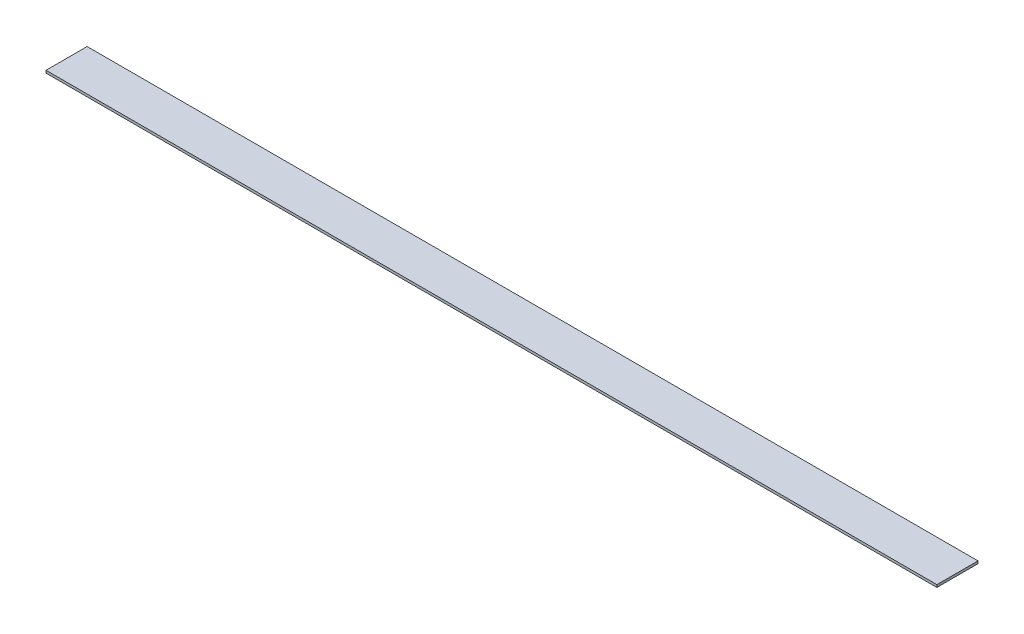
ISO-10303-21;
HEADER;
FILE_DESCRIPTION(('STEP AP214'),'2;1');
FILE_NAME('part.step','',(''),(''),'','','');
FILE_SCHEMA(('AUTOMOTIVE_DESIGN { 1 0 10303 214 1 1 1 1 }'));
ENDSEC;
DATA;
#1=APPLICATION_CONTEXT('core data for automotive mechanical design processes');
#2=APPLICATION_PROTOCOL_DEFINITION('international standard','automotive_design',2000,#1);
#3=PRODUCT_CONTEXT('',#1,'mechanical');
#4=PRODUCT('Part','Part','',(#3));
#5=PRODUCT_RELATED_PRODUCT_CATEGORY('part','',(#4));
#6=PRODUCT_DEFINITION_FORMATION('','',#4);
#7=PRODUCT_DEFINITION_CONTEXT('part definition',#1,'design');
#8=PRODUCT_DEFINITION('design','',#6,#7);
#9=PRODUCT_DEFINITION_SHAPE('','',#8);
#10=(LENGTH_UNIT() NAMED_UNIT(*) SI_UNIT(.MILLI.,.METRE.));
#11=(NAMED_UNIT(*) PLANE_ANGLE_UNIT() SI_UNIT($,.RADIAN.));
#12=(NAMED_UNIT(*) SI_UNIT($,.STERADIAN.) SOLID_ANGLE_UNIT());
#13=UNCERTAINTY_MEASURE_WITH_UNIT(LENGTH_MEASURE(1.E-05),#10,'distance_accuracy_value','');
#14=(GEOMETRIC_REPRESENTATION_CONTEXT(3) GLOBAL_UNCERTAINTY_ASSIGNED_CONTEXT((#13)) GLOBAL_UNIT_ASSIGNED_CONTEXT((#10,
#11,#12)) REPRESENTATION_CONTEXT('',''));
#15=CARTESIAN_POINT('',(0.,0.,0.));
#16=DIRECTION('',(0.,0.,1.));
#17=DIRECTION('',(1.,0.,0.));
#18=AXIS2_PLACEMENT_3D('',#15,#16,#17);
#19=CARTESIAN_POINT('',(541.5,3.,-25.));
#20=DIRECTION('',(-1.,0.,0.));
#21=DIRECTION('',(0.,0.,1.));
#22=AXIS2_PLACEMENT_3D('',#19,#20,#21);
#23=PLANE('',#22);
#24=DIRECTION('',(0.,0.,-1.));
#25=VECTOR('',#24,1.);
#26=CARTESIAN_POINT('',(541.5,0.,-25.));
#27=LINE('',#26,#25);
#28=CARTESIAN_POINT('',(541.5,0.,25.));
#29=VERTEX_POINT('',#28);
#30=CARTESIAN_POINT('',(541.5,0.,-25.));
#31=VERTEX_POINT('',#30);
#32=EDGE_CURVE('E95',#29,#31,#27,.T.);
#33=ORIENTED_EDGE('',*,*,#32,.T.);
#34=DIRECTION('',(0.,-1.,0.));
#35=VECTOR('',#34,1.);
#36=CARTESIAN_POINT('',(541.5,3.,-25.));
#37=LINE('',#36,#35);
#38=CARTESIAN_POINT('',(541.5,3.,-25.));
#39=VERTEX_POINT('',#38);
#40=EDGE_CURVE('E11',#39,#31,#37,.T.);
#41=ORIENTED_EDGE('',*,*,#40,.F.);
#42=DIRECTION('',(0.,0.,-1.));
#43=VECTOR('',#42,1.);
#44=CARTESIAN_POINT('',(541.5,3.,-25.));
#45=LINE('',#44,#43);
#46=CARTESIAN_POINT('',(541.5,3.,25.));
#47=VERTEX_POINT('',#46);
#48=EDGE_CURVE('E83',#47,#39,#45,.T.);
#49=ORIENTED_EDGE('',*,*,#48,.F.);
#50=DIRECTION('',(0.,-1.,0.));
#51=VECTOR('',#50,1.);
#52=CARTESIAN_POINT('',(541.5,3.,25.));
#53=LINE('',#52,#51);
#54=EDGE_CURVE('E91',#47,#29,#53,.T.);
#55=ORIENTED_EDGE('',*,*,#54,.T.);
#56=EDGE_LOOP('',(#33,#41,#49,#55));
#57=FACE_BOUND('',#56,.T.);
#58=ADVANCED_FACE('F32',(#57),#23,.F.);
#59=CARTESIAN_POINT('',(-541.5,3.,-25.));
#60=DIRECTION('',(0.,0.,1.));
#61=DIRECTION('',(1.,0.,0.));
#62=AXIS2_PLACEMENT_3D('',#59,#60,#61);
#63=PLANE('',#62);
#64=DIRECTION('',(-1.,0.,0.));
#65=VECTOR('',#64,1.);
#66=CARTESIAN_POINT('',(-541.5,0.,-25.));
#67=LINE('',#66,#65);
#68=CARTESIAN_POINT('',(-541.5,0.,-25.));
#69=VERTEX_POINT('',#68);
#70=EDGE_CURVE('E87',#31,#69,#67,.T.);
#71=ORIENTED_EDGE('',*,*,#70,.T.);
#72=DIRECTION('',(0.,-1.,0.));
#73=VECTOR('',#72,1.);
#74=CARTESIAN_POINT('',(-541.5,3.,-25.));
#75=LINE('',#74,#73);
#76=CARTESIAN_POINT('',(-541.5,3.,-25.));
#77=VERTEX_POINT('',#76);
#78=EDGE_CURVE('E40',#77,#69,#75,.T.);
#79=ORIENTED_EDGE('',*,*,#78,.F.);
#80=DIRECTION('',(-1.,0.,0.));
#81=VECTOR('',#80,1.);
#82=CARTESIAN_POINT('',(-541.5,3.,-25.));
#83=LINE('',#82,#81);
#84=EDGE_CURVE('E78',#39,#77,#83,.T.);
#85=ORIENTED_EDGE('',*,*,#84,.F.);
#86=ORIENTED_EDGE('',*,*,#40,.T.);
#87=EDGE_LOOP('',(#71,#79,#85,#86));
#88=FACE_BOUND('',#87,.T.);
#89=ADVANCED_FACE('F86',(#88),#63,.F.);
#90=CARTESIAN_POINT('',(-541.5,3.,-25.));
#91=DIRECTION('',(1.,0.,0.));
#92=DIRECTION('',(0.,0.,-1.));
#93=AXIS2_PLACEMENT_3D('',#90,#91,#92);
#94=PLANE('',#93);
#95=DIRECTION('',(0.,0.,1.));
#96=VECTOR('',#95,1.);
#97=CARTESIAN_POINT('',(-541.5,0.,-25.));
#98=LINE('',#97,#96);
#99=CARTESIAN_POINT('',(-541.5,0.,25.));
#100=VERTEX_POINT('',#99);
#101=EDGE_CURVE('E65',#69,#100,#98,.T.);
#102=ORIENTED_EDGE('',*,*,#101,.T.);
#103=DIRECTION('',(0.,-1.,0.));
#104=VECTOR('',#103,1.);
#105=CARTESIAN_POINT('',(-541.5,3.,25.));
#106=LINE('',#105,#104);
#107=CARTESIAN_POINT('',(-541.5,3.,25.));
#108=VERTEX_POINT('',#107);
#109=EDGE_CURVE('E88',#108,#100,#106,.T.);
#110=ORIENTED_EDGE('',*,*,#109,.F.);
#111=DIRECTION('',(0.,0.,1.));
#112=VECTOR('',#111,1.);
#113=CARTESIAN_POINT('',(-541.5,3.,-25.));
#114=LINE('',#113,#112);
#115=EDGE_CURVE('E81',#77,#108,#114,.T.);
#116=ORIENTED_EDGE('',*,*,#115,.F.);
#117=ORIENTED_EDGE('',*,*,#78,.T.);
#118=EDGE_LOOP('',(#102,#110,#116,#117));
#119=FACE_BOUND('',#118,.T.);
#120=ADVANCED_FACE('F89',(#119),#94,.F.);
#121=CARTESIAN_POINT('',(-541.5,3.,25.));
#122=DIRECTION('',(0.,0.,-1.));
#123=DIRECTION('',(-1.,0.,0.));
#124=AXIS2_PLACEMENT_3D('',#121,#122,#123);
#125=PLANE('',#124);
#126=DIRECTION('',(1.,0.,0.));
#127=VECTOR('',#126,1.);
#128=CARTESIAN_POINT('',(-541.5,0.,25.));
#129=LINE('',#128,#127);
#130=EDGE_CURVE('E71',#100,#29,#129,.T.);
#131=ORIENTED_EDGE('',*,*,#130,.T.);
#132=ORIENTED_EDGE('',*,*,#54,.F.);
#133=DIRECTION('',(1.,0.,0.));
#134=VECTOR('',#133,1.);
#135=CARTESIAN_POINT('',(-541.5,3.,25.));
#136=LINE('',#135,#134);
#137=EDGE_CURVE('E48',#108,#47,#136,.T.);
#138=ORIENTED_EDGE('',*,*,#137,.F.);
#139=ORIENTED_EDGE('',*,*,#109,.T.);
#140=EDGE_LOOP('',(#131,#132,#138,#139));
#141=FACE_BOUND('',#140,.T.);
#142=ADVANCED_FACE('F102',(#141),#125,.F.);
#143=CARTESIAN_POINT('',(0.,3.,0.));
#144=DIRECTION('',(0.,1.,0.));
#145=DIRECTION('',(0.,0.,1.));
#146=AXIS2_PLACEMENT_3D('',#143,#144,#145);
#147=PLANE('',#146);
#148=ORIENTED_EDGE('',*,*,#48,.T.);
#149=ORIENTED_EDGE('',*,*,#84,.T.);
#150=ORIENTED_EDGE('',*,*,#115,.T.);
#151=ORIENTED_EDGE('',*,*,#137,.T.);
#152=EDGE_LOOP('',(#148,#149,#150,#151));
#153=FACE_BOUND('',#152,.T.);
#154=ADVANCED_FACE('F79',(#153),#147,.T.);
#155=CARTESIAN_POINT('',(0.,0.,0.));
#156=DIRECTION('',(0.,1.,0.));
#157=DIRECTION('',(0.,0.,1.));
#158=AXIS2_PLACEMENT_3D('',#155,#156,#157);
#159=PLANE('',#158);
#160=ORIENTED_EDGE('',*,*,#32,.F.);
#161=ORIENTED_EDGE('',*,*,#130,.F.);
#162=ORIENTED_EDGE('',*,*,#101,.F.);
#163=ORIENTED_EDGE('',*,*,#70,.F.);
#164=EDGE_LOOP('',(#160,#161,#162,#163));
#165=FACE_BOUND('',#164,.T.);
#166=ADVANCED_FACE('F105',(#165),#159,.F.);
#167=CLOSED_SHELL('',(#58,#89,#120,#142,#154,#166));
#168=MANIFOLD_SOLID_BREP('B2',#167);
#169=ADVANCED_BREP_SHAPE_REPRESENTATION('',(#18,#168),#14);
#170=SHAPE_DEFINITION_REPRESENTATION(#9,#169);
ENDSEC;
END-ISO-10303-21;
